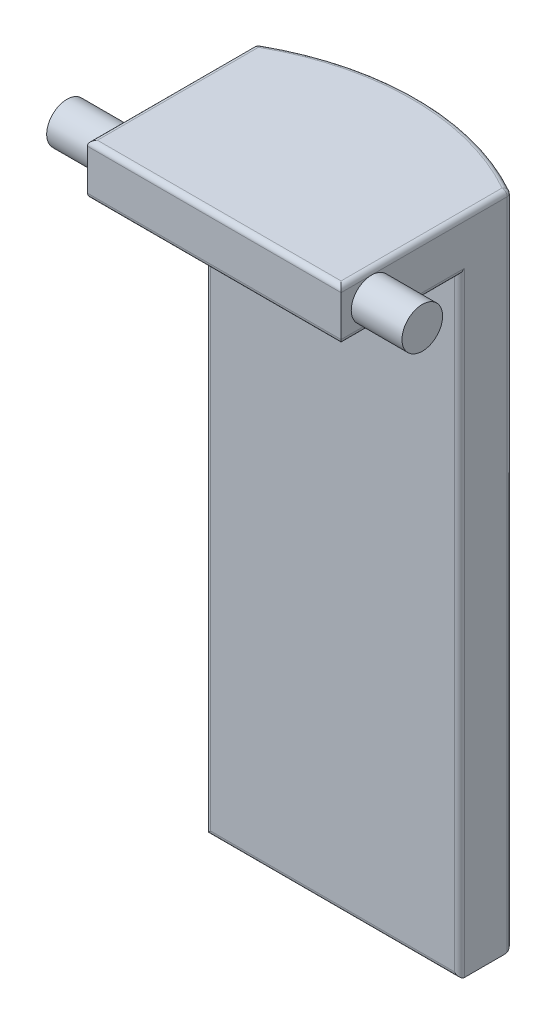
ISO-10303-21;
HEADER;
FILE_DESCRIPTION(('STEP AP214'),'2;1');
FILE_NAME('part.step','',(''),(''),'','','');
FILE_SCHEMA(('AUTOMOTIVE_DESIGN { 1 0 10303 214 1 1 1 1 }'));
ENDSEC;
DATA;
#1=APPLICATION_CONTEXT('core data for automotive mechanical design processes');
#2=APPLICATION_PROTOCOL_DEFINITION('international standard','automotive_design',2000,#1);
#3=PRODUCT_CONTEXT('',#1,'mechanical');
#4=PRODUCT('Part','Part','',(#3));
#5=PRODUCT_RELATED_PRODUCT_CATEGORY('part','',(#4));
#6=PRODUCT_DEFINITION_FORMATION('','',#4);
#7=PRODUCT_DEFINITION_CONTEXT('part definition',#1,'design');
#8=PRODUCT_DEFINITION('design','',#6,#7);
#9=PRODUCT_DEFINITION_SHAPE('','',#8);
#10=(LENGTH_UNIT() NAMED_UNIT(*) SI_UNIT(.MILLI.,.METRE.));
#11=(NAMED_UNIT(*) PLANE_ANGLE_UNIT() SI_UNIT($,.RADIAN.));
#12=(NAMED_UNIT(*) SI_UNIT($,.STERADIAN.) SOLID_ANGLE_UNIT());
#13=UNCERTAINTY_MEASURE_WITH_UNIT(LENGTH_MEASURE(1.E-05),#10,'distance_accuracy_value','');
#14=(GEOMETRIC_REPRESENTATION_CONTEXT(3) GLOBAL_UNCERTAINTY_ASSIGNED_CONTEXT((#13)) GLOBAL_UNIT_ASSIGNED_CONTEXT((#10,
#11,#12)) REPRESENTATION_CONTEXT('',''));
#15=CARTESIAN_POINT('',(0.,0.,0.));
#16=DIRECTION('',(0.,0.,1.));
#17=DIRECTION('',(1.,0.,0.));
#18=AXIS2_PLACEMENT_3D('',#15,#16,#17);
#19=CARTESIAN_POINT('',(12.5,-69.,0.));
#20=DIRECTION('',(-1.,0.,0.));
#21=DIRECTION('',(0.,0.,1.));
#22=AXIS2_PLACEMENT_3D('',#19,#20,#21);
#23=PLANE('',#22);
#24=DIRECTION('',(0.,1.,0.));
#25=VECTOR('',#24,1.);
#26=CARTESIAN_POINT('',(12.5,0.,-5.));
#27=LINE('',#26,#25);
#28=CARTESIAN_POINT('',(12.5,-4.5,-5.));
#29=VERTEX_POINT('',#28);
#30=CARTESIAN_POINT('',(12.5,-0.5,-5.));
#31=VERTEX_POINT('',#30);
#32=EDGE_CURVE('E304',#29,#31,#27,.T.);
#33=ORIENTED_EDGE('',*,*,#32,.F.);
#34=DIRECTION('',(0.,0.,1.));
#35=VECTOR('',#34,1.);
#36=CARTESIAN_POINT('',(12.5,-4.5,0.));
#37=LINE('',#36,#35);
#38=CARTESIAN_POINT('',(12.5,-4.5,-8.));
#39=VERTEX_POINT('',#38);
#40=EDGE_CURVE('E309',#29,#39,#37,.F.);
#41=ORIENTED_EDGE('',*,*,#40,.T.);
#42=CARTESIAN_POINT('',(12.5,-2.5,-8.));
#43=DIRECTION('',(-1.,0.,0.));
#44=DIRECTION('',(0.,0.,1.));
#45=AXIS2_PLACEMENT_3D('',#42,#43,#44);
#46=CIRCLE('',#45,2.);
#47=CARTESIAN_POINT('',(12.5,-0.5,-8.));
#48=VERTEX_POINT('',#47);
#49=EDGE_CURVE('E305',#39,#48,#46,.T.);
#50=ORIENTED_EDGE('',*,*,#49,.T.);
#51=DIRECTION('',(0.,0.,1.));
#52=VECTOR('',#51,1.);
#53=CARTESIAN_POINT('',(12.5,-0.5,-5.));
#54=LINE('',#53,#52);
#55=EDGE_CURVE('E320',#48,#31,#54,.T.);
#56=ORIENTED_EDGE('',*,*,#55,.T.);
#57=EDGE_LOOP('',(#33,#41,#50,#56));
#58=FACE_BOUND('',#57,.T.);
#59=ADVANCED_FACE('F38',(#58),#23,.F.);
#60=CARTESIAN_POINT('',(-12.5,-69.,0.));
#61=DIRECTION('',(-1.,0.,0.));
#62=DIRECTION('',(0.,0.,1.));
#63=AXIS2_PLACEMENT_3D('',#60,#61,#62);
#64=PLANE('',#63);
#65=CARTESIAN_POINT('',(-12.5,-2.5,-8.));
#66=DIRECTION('',(-1.,0.,0.));
#67=DIRECTION('',(0.,0.,1.));
#68=AXIS2_PLACEMENT_3D('',#65,#66,#67);
#69=CIRCLE('',#68,2.);
#70=CARTESIAN_POINT('',(-12.5,-4.5,-8.));
#71=VERTEX_POINT('',#70);
#72=CARTESIAN_POINT('',(-12.5,-0.5,-8.));
#73=VERTEX_POINT('',#72);
#74=EDGE_CURVE('E431',#71,#73,#69,.T.);
#75=ORIENTED_EDGE('',*,*,#74,.F.);
#76=DIRECTION('',(0.,0.,-1.));
#77=VECTOR('',#76,1.);
#78=CARTESIAN_POINT('',(-12.5,-4.5,-5.));
#79=LINE('',#78,#77);
#80=CARTESIAN_POINT('',(-12.5,-4.5,-5.));
#81=VERTEX_POINT('',#80);
#82=EDGE_CURVE('E391',#71,#81,#79,.F.);
#83=ORIENTED_EDGE('',*,*,#82,.T.);
#84=DIRECTION('',(0.,-1.,0.));
#85=VECTOR('',#84,1.);
#86=CARTESIAN_POINT('',(-12.5,-69.,-5.00000000000001));
#87=LINE('',#86,#85);
#88=CARTESIAN_POINT('',(-12.5,-0.5,-5.));
#89=VERTEX_POINT('',#88);
#90=EDGE_CURVE('E423',#89,#81,#87,.T.);
#91=ORIENTED_EDGE('',*,*,#90,.F.);
#92=DIRECTION('',(0.,0.,1.));
#93=VECTOR('',#92,1.);
#94=CARTESIAN_POINT('',(-12.5,-0.5,0.));
#95=LINE('',#94,#93);
#96=EDGE_CURVE('E158',#89,#73,#95,.F.);
#97=ORIENTED_EDGE('',*,*,#96,.T.);
#98=EDGE_LOOP('',(#75,#83,#91,#97));
#99=FACE_BOUND('',#98,.T.);
#100=ADVANCED_FACE('F271',(#99),#64,.T.);
#101=CARTESIAN_POINT('',(0.,-69.,0.));
#102=DIRECTION('',(0.,1.,0.));
#103=DIRECTION('',(0.,0.,1.));
#104=AXIS2_PLACEMENT_3D('',#101,#102,#103);
#105=CYLINDRICAL_SURFACE('',#104,25.);
#106=CARTESIAN_POINT('',(0.,-64.5,0.));
#107=DIRECTION('',(0.,1.,0.));
#108=DIRECTION('',(0.,0.,1.));
#109=AXIS2_PLACEMENT_3D('',#106,#107,#108);
#110=CIRCLE('',#109,25.);
#111=CARTESIAN_POINT('',(12.2448979591837,-64.5,-21.7959279217284));
#112=VERTEX_POINT('',#111);
#113=CARTESIAN_POINT('',(-12.2448979591837,-64.5,-21.7959279217284));
#114=VERTEX_POINT('',#113);
#115=EDGE_CURVE('E390',#112,#114,#110,.T.);
#116=ORIENTED_EDGE('',*,*,#115,.T.);
#117=DIRECTION('',(0.,1.,0.));
#118=VECTOR('',#117,1.);
#119=CARTESIAN_POINT('',(-12.2448979591837,-69.,-21.7959279217284));
#120=LINE('',#119,#118);
#121=CARTESIAN_POINT('',(-12.2448979591837,-0.5,-21.7959279217284));
#122=VERTEX_POINT('',#121);
#123=EDGE_CURVE('E394',#114,#122,#120,.T.);
#124=ORIENTED_EDGE('',*,*,#123,.T.);
#125=CARTESIAN_POINT('',(0.,-0.5,0.));
#126=DIRECTION('',(0.,1.,0.));
#127=DIRECTION('',(0.,0.,1.));
#128=AXIS2_PLACEMENT_3D('',#125,#126,#127);
#129=CIRCLE('',#128,25.);
#130=CARTESIAN_POINT('',(12.2448979591837,-0.5,-21.7959279217284));
#131=VERTEX_POINT('',#130);
#132=EDGE_CURVE('E393',#122,#131,#129,.F.);
#133=ORIENTED_EDGE('',*,*,#132,.T.);
#134=DIRECTION('',(0.,1.,0.));
#135=VECTOR('',#134,1.);
#136=CARTESIAN_POINT('',(12.2448979591837,-69.,-21.7959279217284));
#137=LINE('',#136,#135);
#138=EDGE_CURVE('E385',#131,#112,#137,.F.);
#139=ORIENTED_EDGE('',*,*,#138,.T.);
#140=EDGE_LOOP('',(#116,#124,#133,#139));
#141=FACE_BOUND('',#140,.T.);
#142=ADVANCED_FACE('F278',(#141),#105,.T.);
#143=CARTESIAN_POINT('',(0.,0.,0.));
#144=DIRECTION('',(0.,1.,0.));
#145=DIRECTION('',(0.,0.,1.));
#146=AXIS2_PLACEMENT_3D('',#143,#144,#145);
#147=PLANE('',#146);
#148=CARTESIAN_POINT('',(0.,0.,0.));
#149=DIRECTION('',(0.,1.,0.));
#150=DIRECTION('',(0.,0.,1.));
#151=AXIS2_PLACEMENT_3D('',#148,#149,#150);
#152=CIRCLE('',#151,24.5);
#153=CARTESIAN_POINT('',(12.,0.,-21.3600093632938));
#154=VERTEX_POINT('',#153);
#155=CARTESIAN_POINT('',(-12.,0.,-21.3600093632938));
#156=VERTEX_POINT('',#155);
#157=EDGE_CURVE('E177',#154,#156,#152,.T.);
#158=ORIENTED_EDGE('',*,*,#157,.T.);
#159=DIRECTION('',(0.,0.,1.));
#160=VECTOR('',#159,1.);
#161=CARTESIAN_POINT('',(-12.,0.,0.));
#162=LINE('',#161,#160);
#163=CARTESIAN_POINT('',(-12.,0.,-5.5));
#164=VERTEX_POINT('',#163);
#165=EDGE_CURVE('E156',#156,#164,#162,.T.);
#166=ORIENTED_EDGE('',*,*,#165,.T.);
#167=DIRECTION('',(1.,0.,0.));
#168=VECTOR('',#167,1.);
#169=CARTESIAN_POINT('',(12.5,0.,-5.5));
#170=LINE('',#169,#168);
#171=CARTESIAN_POINT('',(12.,0.,-5.5));
#172=VERTEX_POINT('',#171);
#173=EDGE_CURVE('E165',#164,#172,#170,.T.);
#174=ORIENTED_EDGE('',*,*,#173,.T.);
#175=DIRECTION('',(0.,0.,1.));
#176=VECTOR('',#175,1.);
#177=CARTESIAN_POINT('',(12.,0.,-21.650635094611));
#178=LINE('',#177,#176);
#179=EDGE_CURVE('E172',#172,#154,#178,.F.);
#180=ORIENTED_EDGE('',*,*,#179,.T.);
#181=EDGE_LOOP('',(#158,#166,#174,#180));
#182=FACE_BOUND('',#181,.T.);
#183=ADVANCED_FACE('F175',(#182),#147,.T.);
#184=EDGE_CURVE('E293',#48,#39,#46,.T.);
#185=ORIENTED_EDGE('',*,*,#184,.T.);
#186=DIRECTION('',(0.,0.,1.));
#187=VECTOR('',#186,1.);
#188=CARTESIAN_POINT('',(12.5,-4.5,0.));
#189=LINE('',#188,#187);
#190=CARTESIAN_POINT('',(12.5,-4.5,-17.150635094611));
#191=VERTEX_POINT('',#190);
#192=EDGE_CURVE('E295',#39,#191,#189,.F.);
#193=ORIENTED_EDGE('',*,*,#192,.T.);
#194=DIRECTION('',(0.,1.,0.));
#195=VECTOR('',#194,1.);
#196=CARTESIAN_POINT('',(12.5,-69.,-17.150635094611));
#197=LINE('',#196,#195);
#198=CARTESIAN_POINT('',(12.5,-65.,-17.150635094611));
#199=VERTEX_POINT('',#198);
#200=EDGE_CURVE('E314',#191,#199,#197,.F.);
#201=ORIENTED_EDGE('',*,*,#200,.T.);
#202=DIRECTION('',(0.,0.,1.));
#203=VECTOR('',#202,1.);
#204=CARTESIAN_POINT('',(12.5,-65.,-16.650635094611));
#205=LINE('',#204,#203);
#206=CARTESIAN_POINT('',(12.5,-65.,-21.0713075057055));
#207=VERTEX_POINT('',#206);
#208=EDGE_CURVE('E238',#207,#199,#205,.T.);
#209=ORIENTED_EDGE('',*,*,#208,.F.);
#210=CARTESIAN_POINT('',(12.5,-65.,-21.0713075057055));
#211=CARTESIAN_POINT('',(12.5,-65.0000306502536,-21.1144354710381));
#212=CARTESIAN_POINT('',(12.5,-64.995871424319,-21.1576928543187));
#213=CARTESIAN_POINT('',(12.5,-64.9794178640378,-21.2416037123669));
#214=CARTESIAN_POINT('',(12.5,-64.9673091091234,-21.2822939101771));
#215=CARTESIAN_POINT('',(12.5,-64.9458588525723,-21.3344084175351));
#216=CARTESIAN_POINT('',(12.5,-64.9400212094912,-21.3473202687149));
#217=CARTESIAN_POINT('',(12.5,-64.9337392476235,-21.3600093632938));
#218=B_SPLINE_CURVE_WITH_KNOTS('',3,(#210,#211,#212,#213,#214,#215,#216,#217),.UNSPECIFIED.,.F.,
.F.,(4,2,2,4),(0.,0.129419415813289,0.255920147616695,0.29839956822105),.UNSPECIFIED.);
#219=CARTESIAN_POINT('',(12.5,-64.9337392476235,-21.3600093632938));
#220=VERTEX_POINT('',#219);
#221=EDGE_CURVE('E405',#207,#220,#218,.T.);
#222=ORIENTED_EDGE('',*,*,#221,.T.);
#223=DIRECTION('',(0.,-1.,0.));
#224=VECTOR('',#223,1.);
#225=CARTESIAN_POINT('',(12.5,0.,-21.3600093632938));
#226=LINE('',#225,#224);
#227=CARTESIAN_POINT('',(12.5,-0.5,-21.3600093632938));
#228=VERTEX_POINT('',#227);
#229=EDGE_CURVE('E400',#220,#228,#226,.F.);
#230=ORIENTED_EDGE('',*,*,#229,.T.);
#231=DIRECTION('',(0.,0.,1.));
#232=VECTOR('',#231,1.);
#233=CARTESIAN_POINT('',(12.5,-0.5,-5.));
#234=LINE('',#233,#232);
#235=EDGE_CURVE('E298',#228,#48,#234,.T.);
#236=ORIENTED_EDGE('',*,*,#235,.T.);
#237=EDGE_LOOP('',(#185,#193,#201,#209,#222,#230,#236));
#238=FACE_BOUND('',#237,.T.);
#239=ADVANCED_FACE('F273',(#238),#23,.F.);
#240=DIRECTION('',(0.,-1.,0.));
#241=VECTOR('',#240,1.);
#242=CARTESIAN_POINT('',(-12.5,-5.,-17.150635094611));
#243=LINE('',#242,#241);
#244=CARTESIAN_POINT('',(-12.5,-65.,-17.150635094611));
#245=VERTEX_POINT('',#244);
#246=CARTESIAN_POINT('',(-12.5,-4.5,-17.150635094611));
#247=VERTEX_POINT('',#246);
#248=EDGE_CURVE('E482',#245,#247,#243,.F.);
#249=ORIENTED_EDGE('',*,*,#248,.T.);
#250=DIRECTION('',(0.,0.,-1.));
#251=VECTOR('',#250,1.);
#252=CARTESIAN_POINT('',(-12.5,-4.5,-5.));
#253=LINE('',#252,#251);
#254=EDGE_CURVE('E484',#247,#71,#253,.F.);
#255=ORIENTED_EDGE('',*,*,#254,.T.);
#256=EDGE_CURVE('E173',#73,#71,#69,.T.);
#257=ORIENTED_EDGE('',*,*,#256,.F.);
#258=DIRECTION('',(0.,0.,1.));
#259=VECTOR('',#258,1.);
#260=CARTESIAN_POINT('',(-12.5,-0.5,0.));
#261=LINE('',#260,#259);
#262=CARTESIAN_POINT('',(-12.5,-0.5,-21.3600093632938));
#263=VERTEX_POINT('',#262);
#264=EDGE_CURVE('E197',#73,#263,#261,.F.);
#265=ORIENTED_EDGE('',*,*,#264,.T.);
#266=DIRECTION('',(0.,1.,0.));
#267=VECTOR('',#266,1.);
#268=CARTESIAN_POINT('',(-12.5,-69.,-21.3600093632938));
#269=LINE('',#268,#267);
#270=CARTESIAN_POINT('',(-12.5,-64.9337392476235,-21.3600093632938));
#271=VERTEX_POINT('',#270);
#272=EDGE_CURVE('E180',#263,#271,#269,.F.);
#273=ORIENTED_EDGE('',*,*,#272,.T.);
#274=CARTESIAN_POINT('',(-12.5,-64.9337392476235,-21.3600093632938));
#275=CARTESIAN_POINT('',(-12.5,-64.9529591126697,-21.3211994609414));
#276=CARTESIAN_POINT('',(-12.5,-64.9679865338698,-21.2803871246245));
#277=CARTESIAN_POINT('',(-12.5,-64.9894526563694,-21.1974858388549));
#278=CARTESIAN_POINT('',(-12.5,-64.9960689104194,-21.1554431416842));
#279=CARTESIAN_POINT('',(-12.5,-64.9995678394943,-21.0992556973158));
#280=CARTESIAN_POINT('',(-12.5,-65.000001484785,-21.085276273918));
#281=CARTESIAN_POINT('',(-12.5,-65.,-21.0713075057055));
#282=B_SPLINE_CURVE_WITH_KNOTS('',3,(#274,#275,#276,#277,#278,#279,#280,#281),.UNSPECIFIED.,.F.,
.F.,(4,2,2,4),(0.,0.129620762898399,0.256457262752572,0.298384799293105),.UNSPECIFIED.);
#283=CARTESIAN_POINT('',(-12.5,-65.,-21.0713075057055));
#284=VERTEX_POINT('',#283);
#285=EDGE_CURVE('E184',#271,#284,#282,.T.);
#286=ORIENTED_EDGE('',*,*,#285,.T.);
#287=DIRECTION('',(0.,0.,-1.));
#288=VECTOR('',#287,1.);
#289=CARTESIAN_POINT('',(-12.5,-65.,0.));
#290=LINE('',#289,#288);
#291=EDGE_CURVE('E445',#245,#284,#290,.T.);
#292=ORIENTED_EDGE('',*,*,#291,.F.);
#293=EDGE_LOOP('',(#249,#255,#257,#265,#273,#286,#292));
#294=FACE_BOUND('',#293,.T.);
#295=ADVANCED_FACE('F199',(#294),#64,.T.);
#296=CARTESIAN_POINT('',(-56.5,-5.,0.));
#297=DIRECTION('',(0.,1.,0.));
#298=DIRECTION('',(0.,0.,1.));
#299=AXIS2_PLACEMENT_3D('',#296,#297,#298);
#300=PLANE('',#299);
#301=DIRECTION('',(1.,0.,0.));
#302=VECTOR('',#301,1.);
#303=CARTESIAN_POINT('',(-56.5,-5.,-16.650635094611));
#304=LINE('',#303,#302);
#305=CARTESIAN_POINT('',(-12.,-5.,-16.650635094611));
#306=VERTEX_POINT('',#305);
#307=CARTESIAN_POINT('',(12.,-5.,-16.650635094611));
#308=VERTEX_POINT('',#307);
#309=EDGE_CURVE('E432',#306,#308,#304,.T.);
#310=ORIENTED_EDGE('',*,*,#309,.T.);
#311=DIRECTION('',(0.,0.,1.));
#312=VECTOR('',#311,1.);
#313=CARTESIAN_POINT('',(12.,-5.,0.));
#314=LINE('',#313,#312);
#315=CARTESIAN_POINT('',(12.,-5.,-5.5));
#316=VERTEX_POINT('',#315);
#317=EDGE_CURVE('E11',#308,#316,#314,.T.);
#318=ORIENTED_EDGE('',*,*,#317,.T.);
#319=DIRECTION('',(-1.,0.,0.));
#320=VECTOR('',#319,1.);
#321=CARTESIAN_POINT('',(-56.5,-5.,-5.50000000000001));
#322=LINE('',#321,#320);
#323=CARTESIAN_POINT('',(-12.,-5.,-5.5));
#324=VERTEX_POINT('',#323);
#325=EDGE_CURVE('E48',#316,#324,#322,.T.);
#326=ORIENTED_EDGE('',*,*,#325,.T.);
#327=DIRECTION('',(0.,0.,-1.));
#328=VECTOR('',#327,1.);
#329=CARTESIAN_POINT('',(-12.,-5.,-16.650635094611));
#330=LINE('',#329,#328);
#331=EDGE_CURVE('E346',#324,#306,#330,.T.);
#332=ORIENTED_EDGE('',*,*,#331,.T.);
#333=EDGE_LOOP('',(#310,#318,#326,#332));
#334=FACE_BOUND('',#333,.T.);
#335=ADVANCED_FACE('F289',(#334),#300,.F.);
#336=CARTESIAN_POINT('',(-56.5,-5.,-16.650635094611));
#337=DIRECTION('',(0.,0.,-1.));
#338=DIRECTION('',(-1.,0.,0.));
#339=AXIS2_PLACEMENT_3D('',#336,#337,#338);
#340=PLANE('',#339);
#341=ORIENTED_EDGE('',*,*,#309,.F.);
#342=DIRECTION('',(0.,-1.,0.));
#343=VECTOR('',#342,1.);
#344=CARTESIAN_POINT('',(-12.,-65.,-16.650635094611));
#345=LINE('',#344,#343);
#346=CARTESIAN_POINT('',(-12.,-64.5,-16.650635094611));
#347=VERTEX_POINT('',#346);
#348=EDGE_CURVE('E336',#306,#347,#345,.T.);
#349=ORIENTED_EDGE('',*,*,#348,.T.);
#350=DIRECTION('',(1.,0.,0.));
#351=VECTOR('',#350,1.);
#352=CARTESIAN_POINT('',(-56.5,-64.5,-16.650635094611));
#353=LINE('',#352,#351);
#354=CARTESIAN_POINT('',(12.,-64.5,-16.650635094611));
#355=VERTEX_POINT('',#354);
#356=EDGE_CURVE('E332',#347,#355,#353,.T.);
#357=ORIENTED_EDGE('',*,*,#356,.T.);
#358=DIRECTION('',(0.,1.,0.));
#359=VECTOR('',#358,1.);
#360=CARTESIAN_POINT('',(12.,-5.,-16.650635094611));
#361=LINE('',#360,#359);
#362=EDGE_CURVE('E329',#355,#308,#361,.T.);
#363=ORIENTED_EDGE('',*,*,#362,.T.);
#364=EDGE_LOOP('',(#341,#349,#357,#363));
#365=FACE_BOUND('',#364,.T.);
#366=ADVANCED_FACE('F481',(#365),#340,.F.);
#367=CARTESIAN_POINT('',(-56.5,0.,-5.00000000000001));
#368=DIRECTION('',(0.,0.,-1.));
#369=DIRECTION('',(-1.,0.,0.));
#370=AXIS2_PLACEMENT_3D('',#367,#368,#369);
#371=PLANE('',#370);
#372=ORIENTED_EDGE('',*,*,#32,.T.);
#373=DIRECTION('',(1.,0.,0.));
#374=VECTOR('',#373,1.);
#375=CARTESIAN_POINT('',(-12.5,-0.5,-5.));
#376=LINE('',#375,#374);
#377=EDGE_CURVE('E326',#31,#89,#376,.F.);
#378=ORIENTED_EDGE('',*,*,#377,.T.);
#379=ORIENTED_EDGE('',*,*,#90,.T.);
#380=DIRECTION('',(-1.,0.,0.));
#381=VECTOR('',#380,1.);
#382=CARTESIAN_POINT('',(-56.5,-4.5,-5.00000000000001));
#383=LINE('',#382,#381);
#384=EDGE_CURVE('E318',#81,#29,#383,.F.);
#385=ORIENTED_EDGE('',*,*,#384,.T.);
#386=EDGE_LOOP('',(#372,#378,#379,#385));
#387=FACE_BOUND('',#386,.T.);
#388=ADVANCED_FACE('F418',(#387),#371,.F.);
#389=CARTESIAN_POINT('',(-17.5,-2.5,-8.));
#390=DIRECTION('',(1.,0.,0.));
#391=DIRECTION('',(0.,0.,-1.));
#392=AXIS2_PLACEMENT_3D('',#389,#390,#391);
#393=PLANE('',#392);
#394=CARTESIAN_POINT('',(-17.5,-2.5,-8.));
#395=DIRECTION('',(1.,0.,0.));
#396=DIRECTION('',(0.,0.,-1.));
#397=AXIS2_PLACEMENT_3D('',#394,#395,#396);
#398=CIRCLE('',#397,2.);
#399=CARTESIAN_POINT('',(-17.5,-2.5,-10.));
#400=VERTEX_POINT('',#399);
#401=EDGE_CURVE('E437',#400,#400,#398,.T.);
#402=ORIENTED_EDGE('',*,*,#401,.F.);
#403=EDGE_LOOP('',(#402));
#404=FACE_BOUND('',#403,.T.);
#405=ADVANCED_FACE('F563',(#404),#393,.F.);
#406=CARTESIAN_POINT('',(-17.5,-2.5,-8.));
#407=DIRECTION('',(1.,0.,0.));
#408=DIRECTION('',(0.,0.,-1.));
#409=AXIS2_PLACEMENT_3D('',#406,#407,#408);
#410=CYLINDRICAL_SURFACE('',#409,2.);
#411=ORIENTED_EDGE('',*,*,#256,.T.);
#412=ORIENTED_EDGE('',*,*,#74,.T.);
#413=EDGE_LOOP('',(#411,#412));
#414=FACE_BOUND('',#413,.T.);
#415=ORIENTED_EDGE('',*,*,#401,.T.);
#416=EDGE_LOOP('',(#415));
#417=FACE_BOUND('',#416,.T.);
#418=ADVANCED_FACE('F496',(#414,#417),#410,.T.);
#419=CARTESIAN_POINT('',(17.5,-2.5,-8.));
#420=DIRECTION('',(1.,0.,0.));
#421=DIRECTION('',(0.,0.,-1.));
#422=AXIS2_PLACEMENT_3D('',#419,#420,#421);
#423=CIRCLE('',#422,2.);
#424=CARTESIAN_POINT('',(17.5,-2.5,-10.));
#425=VERTEX_POINT('',#424);
#426=EDGE_CURVE('E441',#425,#425,#423,.T.);
#427=ORIENTED_EDGE('',*,*,#426,.F.);
#428=EDGE_LOOP('',(#427));
#429=FACE_BOUND('',#428,.T.);
#430=ORIENTED_EDGE('',*,*,#184,.F.);
#431=ORIENTED_EDGE('',*,*,#49,.F.);
#432=EDGE_LOOP('',(#430,#431));
#433=FACE_BOUND('',#432,.T.);
#434=ADVANCED_FACE('F546',(#429,#433),#410,.T.);
#435=CARTESIAN_POINT('',(17.5,-2.5,-8.));
#436=DIRECTION('',(1.,0.,0.));
#437=DIRECTION('',(0.,0.,-1.));
#438=AXIS2_PLACEMENT_3D('',#435,#436,#437);
#439=PLANE('',#438);
#440=ORIENTED_EDGE('',*,*,#426,.T.);
#441=EDGE_LOOP('',(#440));
#442=FACE_BOUND('',#441,.T.);
#443=ADVANCED_FACE('F537',(#442),#439,.T.);
#444=CARTESIAN_POINT('',(-17.5,-65.,-16.650635094611));
#445=DIRECTION('',(0.,1.,0.));
#446=DIRECTION('',(0.,0.,1.));
#447=AXIS2_PLACEMENT_3D('',#444,#445,#446);
#448=PLANE('',#447);
#449=ORIENTED_EDGE('',*,*,#208,.T.);
#450=DIRECTION('',(1.,0.,0.));
#451=VECTOR('',#450,1.);
#452=CARTESIAN_POINT('',(-17.5,-65.,-17.150635094611));
#453=LINE('',#452,#451);
#454=EDGE_CURVE('E342',#199,#245,#453,.F.);
#455=ORIENTED_EDGE('',*,*,#454,.T.);
#456=ORIENTED_EDGE('',*,*,#291,.T.);
#457=CARTESIAN_POINT('',(0.,-65.,0.));
#458=DIRECTION('',(0.,1.,0.));
#459=DIRECTION('',(0.,0.,1.));
#460=AXIS2_PLACEMENT_3D('',#457,#458,#459);
#461=CIRCLE('',#460,24.5);
#462=EDGE_CURVE('E339',#284,#207,#461,.F.);
#463=ORIENTED_EDGE('',*,*,#462,.T.);
#464=EDGE_LOOP('',(#449,#455,#456,#463));
#465=FACE_BOUND('',#464,.T.);
#466=ADVANCED_FACE('F245',(#465),#448,.F.);
#467=CARTESIAN_POINT('',(12.,-69.,-21.3600093632938));
#468=DIRECTION('',(0.,1.,0.));
#469=DIRECTION('',(0.,0.,1.));
#470=AXIS2_PLACEMENT_3D('',#467,#468,#469);
#471=CYLINDRICAL_SURFACE('',#470,0.5);
#472=CARTESIAN_POINT('',(12.,-0.5,-21.3600093632938));
#473=DIRECTION('',(0.,1.,0.));
#474=DIRECTION('',(0.,0.,1.));
#475=AXIS2_PLACEMENT_3D('',#472,#473,#474);
#476=CIRCLE('',#475,0.5);
#477=EDGE_CURVE('E239',#228,#131,#476,.T.);
#478=ORIENTED_EDGE('',*,*,#477,.F.);
#479=ORIENTED_EDGE('',*,*,#229,.F.);
#480=CARTESIAN_POINT('',(12.5,-64.9337392476235,-21.3600093632938));
#481=CARTESIAN_POINT('',(12.4999647044968,-64.9182954563024,-21.3911474722137));
#482=CARTESIAN_POINT('',(12.4970990540357,-64.9010114724677,-21.4211254287435));
#483=CARTESIAN_POINT('',(12.48668694637,-64.8638584835312,-21.4782394687068));
#484=CARTESIAN_POINT('',(12.4791791029237,-64.8440118611124,-21.5053968588971));
#485=CARTESIAN_POINT('',(12.4576222269717,-64.7963319066022,-21.5645799584676));
#486=CARTESIAN_POINT('',(12.442287282573,-64.7678873393451,-21.5956261352261));
#487=CARTESIAN_POINT('',(12.4066445004382,-64.7091311241989,-21.6528950450283));
#488=CARTESIAN_POINT('',(12.3863176264116,-64.6788126696414,-21.6790986246048));
#489=CARTESIAN_POINT('',(12.3467620997228,-64.624231141872,-21.7211030207324));
#490=CARTESIAN_POINT('',(12.3283291768073,-64.6001535043489,-21.7379154587451));
#491=CARTESIAN_POINT('',(12.289448916797,-64.551771698249,-21.7684557543794));
#492=CARTESIAN_POINT('',(12.2690067258346,-64.5274682456439,-21.7821912110974));
#493=CARTESIAN_POINT('',(12.2467622569459,-64.5021187761299,-21.7948766203591));
#494=CARTESIAN_POINT('',(12.2458309316936,-64.5010593688234,-21.7954037767808));
#495=CARTESIAN_POINT('',(12.2448979591837,-64.5,-21.7959279217284));
#496=B_SPLINE_CURVE_WITH_KNOTS('',3,(#480,#481,#482,#483,#484,#485,#486,#487,#488,#489,#490,
#491,#492,#493,#494,#495),.UNSPECIFIED.,.F.,.F.,(4,2,2,2,2,2,2,4),(0.,0.10377110778221,
0.206690448396533,0.340448297909584,0.474724365192657,0.57855939088652,0.682135080837569,
0.686652632110638),.UNSPECIFIED.);
#497=EDGE_CURVE('E229',#112,#220,#496,.F.);
#498=ORIENTED_EDGE('',*,*,#497,.F.);
#499=ORIENTED_EDGE('',*,*,#138,.F.);
#500=EDGE_LOOP('',(#478,#479,#498,#499));
#501=FACE_BOUND('',#500,.T.);
#502=ADVANCED_FACE('F209',(#501),#471,.T.);
#503=CARTESIAN_POINT('',(0.,-64.5,0.));
#504=DIRECTION('',(0.,1.,0.));
#505=DIRECTION('',(0.,0.,1.));
#506=AXIS2_PLACEMENT_3D('',#503,#504,#505);
#507=TOROIDAL_SURFACE('',#506,24.5,0.5);
#508=ORIENTED_EDGE('',*,*,#462,.F.);
#509=ORIENTED_EDGE('',*,*,#285,.F.);
#510=CARTESIAN_POINT('',(-12.5,-64.9337392476235,-21.3600093632938));
#511=CARTESIAN_POINT('',(-12.4999647044968,-64.9182954563024,-21.3911474722137));
#512=CARTESIAN_POINT('',(-12.4970990540357,-64.9010114724677,-21.4211254287435));
#513=CARTESIAN_POINT('',(-12.48668694637,-64.8638584835312,-21.4782394687068));
#514=CARTESIAN_POINT('',(-12.4791791029237,-64.8440118611124,-21.5053968588971));
#515=CARTESIAN_POINT('',(-12.4576222269717,-64.7963319066022,-21.5645799584676));
#516=CARTESIAN_POINT('',(-12.442287282573,-64.7678873393451,-21.5956261352261));
#517=CARTESIAN_POINT('',(-12.4066445004382,-64.7091311241989,-21.6528950450283));
#518=CARTESIAN_POINT('',(-12.3863176264116,-64.6788126696414,-21.6790986246048));
#519=CARTESIAN_POINT('',(-12.3467620997228,-64.624231141872,-21.7211030207324));
#520=CARTESIAN_POINT('',(-12.3283291768073,-64.6001535043489,-21.7379154587451));
#521=CARTESIAN_POINT('',(-12.289448916797,-64.551771698249,-21.7684557543794));
#522=CARTESIAN_POINT('',(-12.2690067258346,-64.5274682456439,-21.7821912110974));
#523=CARTESIAN_POINT('',(-12.2467622569459,-64.5021187761299,-21.7948766203591));
#524=CARTESIAN_POINT('',(-12.2458309316936,-64.5010593688234,-21.7954037767808));
#525=CARTESIAN_POINT('',(-12.2448979591837,-64.5,-21.7959279217284));
#526=B_SPLINE_CURVE_WITH_KNOTS('',3,(#510,#511,#512,#513,#514,#515,#516,#517,#518,#519,#520,
#521,#522,#523,#524,#525),.UNSPECIFIED.,.F.,.F.,(4,2,2,2,2,2,2,4),(0.,0.10377110778221,
0.206690448396533,0.340448297909584,0.474724365192657,0.57855939088652,0.682135080837569,
0.686652632110638),.UNSPECIFIED.);
#527=EDGE_CURVE('E219',#114,#271,#526,.F.);
#528=ORIENTED_EDGE('',*,*,#527,.F.);
#529=ORIENTED_EDGE('',*,*,#115,.F.);
#530=ORIENTED_EDGE('',*,*,#497,.T.);
#531=ORIENTED_EDGE('',*,*,#221,.F.);
#532=EDGE_LOOP('',(#508,#509,#528,#529,#530,#531));
#533=FACE_BOUND('',#532,.T.);
#534=ADVANCED_FACE('F203',(#533),#507,.T.);
#535=CARTESIAN_POINT('',(12.,-0.5,-21.3600093632938));
#536=DIRECTION('',(0.,1.,0.));
#537=DIRECTION('',(0.,0.,1.));
#538=AXIS2_PLACEMENT_3D('',#535,#536,#537);
#539=SPHERICAL_SURFACE('',#538,0.5);
#540=CARTESIAN_POINT('',(12.,-0.5,-21.3600093632938));
#541=DIRECTION('',(0.,0.,-1.));
#542=DIRECTION('',(-1.,0.,0.));
#543=AXIS2_PLACEMENT_3D('',#540,#541,#542);
#544=CIRCLE('',#543,0.5);
#545=EDGE_CURVE('E363',#228,#154,#544,.F.);
#546=ORIENTED_EDGE('',*,*,#545,.F.);
#547=ORIENTED_EDGE('',*,*,#477,.T.);
#548=CARTESIAN_POINT('',(12.,-0.5,-21.3600093632938));
#549=DIRECTION('',(0.871837116869134,0.,0.489795918367349));
#550=DIRECTION('',(0.489795918367349,0.,-0.871837116869134));
#551=AXIS2_PLACEMENT_3D('',#548,#549,#550);
#552=CIRCLE('',#551,0.5);
#553=EDGE_CURVE('E366',#154,#131,#552,.F.);
#554=ORIENTED_EDGE('',*,*,#553,.F.);
#555=EDGE_LOOP('',(#546,#547,#554));
#556=FACE_BOUND('',#555,.T.);
#557=ADVANCED_FACE('F208',(#556),#539,.T.);
#558=CARTESIAN_POINT('',(-12.,-69.,-21.3600093632938));
#559=DIRECTION('',(0.,1.,0.));
#560=DIRECTION('',(0.,0.,1.));
#561=AXIS2_PLACEMENT_3D('',#558,#559,#560);
#562=CYLINDRICAL_SURFACE('',#561,0.5);
#563=ORIENTED_EDGE('',*,*,#527,.T.);
#564=ORIENTED_EDGE('',*,*,#272,.F.);
#565=CARTESIAN_POINT('',(-12.,-0.5,-21.3600093632938));
#566=DIRECTION('',(0.,1.,0.));
#567=DIRECTION('',(-1.,0.,0.));
#568=AXIS2_PLACEMENT_3D('',#565,#566,#567);
#569=CIRCLE('',#568,0.5);
#570=EDGE_CURVE('E359',#122,#263,#569,.T.);
#571=ORIENTED_EDGE('',*,*,#570,.F.);
#572=ORIENTED_EDGE('',*,*,#123,.F.);
#573=EDGE_LOOP('',(#563,#564,#571,#572));
#574=FACE_BOUND('',#573,.T.);
#575=ADVANCED_FACE('F213',(#574),#562,.T.);
#576=CARTESIAN_POINT('',(0.,-0.5,0.));
#577=DIRECTION('',(0.,1.,0.));
#578=DIRECTION('',(0.,0.,1.));
#579=AXIS2_PLACEMENT_3D('',#576,#577,#578);
#580=TOROIDAL_SURFACE('',#579,24.5,0.5);
#581=ORIENTED_EDGE('',*,*,#553,.T.);
#582=ORIENTED_EDGE('',*,*,#132,.F.);
#583=CARTESIAN_POINT('',(-12.,-0.5,-21.3600093632938));
#584=DIRECTION('',(-0.871837116869136,0.,0.489795918367347));
#585=DIRECTION('',(0.489795918367347,0.,0.871837116869136));
#586=AXIS2_PLACEMENT_3D('',#583,#584,#585);
#587=CIRCLE('',#586,0.5);
#588=EDGE_CURVE('E355',#156,#122,#587,.T.);
#589=ORIENTED_EDGE('',*,*,#588,.F.);
#590=ORIENTED_EDGE('',*,*,#157,.F.);
#591=EDGE_LOOP('',(#581,#582,#589,#590));
#592=FACE_BOUND('',#591,.T.);
#593=ADVANCED_FACE('F211',(#592),#580,.T.);
#594=CARTESIAN_POINT('',(12.,-0.5,0.));
#595=DIRECTION('',(0.,0.,-1.));
#596=DIRECTION('',(-1.,0.,0.));
#597=AXIS2_PLACEMENT_3D('',#594,#595,#596);
#598=CYLINDRICAL_SURFACE('',#597,0.5);
#599=ORIENTED_EDGE('',*,*,#545,.T.);
#600=ORIENTED_EDGE('',*,*,#179,.F.);
#601=CARTESIAN_POINT('',(12.,-0.5,-5.5));
#602=DIRECTION('',(-0.707106781186548,0.,0.707106781186547));
#603=DIRECTION('',(-0.707106781186547,0.,-0.707106781186548));
#604=AXIS2_PLACEMENT_3D('',#601,#602,#603);
#605=ELLIPSE('',#604,0.707106781186547,0.5);
#606=EDGE_CURVE('E168',#31,#172,#605,.T.);
#607=ORIENTED_EDGE('',*,*,#606,.F.);
#608=ORIENTED_EDGE('',*,*,#55,.F.);
#609=ORIENTED_EDGE('',*,*,#235,.F.);
#610=EDGE_LOOP('',(#599,#600,#607,#608,#609));
#611=FACE_BOUND('',#610,.T.);
#612=ADVANCED_FACE('F425',(#611),#598,.T.);
#613=CARTESIAN_POINT('',(-12.,-0.5,-21.3600093632938));
#614=DIRECTION('',(0.,1.,0.));
#615=DIRECTION('',(0.,0.,1.));
#616=AXIS2_PLACEMENT_3D('',#613,#614,#615);
#617=SPHERICAL_SURFACE('',#616,0.5);
#618=ORIENTED_EDGE('',*,*,#588,.T.);
#619=ORIENTED_EDGE('',*,*,#570,.T.);
#620=CARTESIAN_POINT('',(-12.,-0.5,-21.3600093632938));
#621=DIRECTION('',(0.,0.,-1.));
#622=DIRECTION('',(-1.,0.,0.));
#623=AXIS2_PLACEMENT_3D('',#620,#621,#622);
#624=CIRCLE('',#623,0.5);
#625=EDGE_CURVE('E162',#156,#263,#624,.F.);
#626=ORIENTED_EDGE('',*,*,#625,.F.);
#627=EDGE_LOOP('',(#618,#619,#626));
#628=FACE_BOUND('',#627,.T.);
#629=ADVANCED_FACE('F502',(#628),#617,.T.);
#630=CARTESIAN_POINT('',(0.,-0.5,-5.5));
#631=DIRECTION('',(-1.,0.,0.));
#632=DIRECTION('',(0.,0.,1.));
#633=AXIS2_PLACEMENT_3D('',#630,#631,#632);
#634=CYLINDRICAL_SURFACE('',#633,0.5);
#635=ORIENTED_EDGE('',*,*,#606,.T.);
#636=ORIENTED_EDGE('',*,*,#173,.F.);
#637=CARTESIAN_POINT('',(-12.,-0.5,-5.5));
#638=DIRECTION('',(-0.707106781186547,0.,-0.707106781186547));
#639=DIRECTION('',(-0.707106781186547,0.,0.707106781186547));
#640=AXIS2_PLACEMENT_3D('',#637,#638,#639);
#641=ELLIPSE('',#640,0.707106781186547,0.5);
#642=EDGE_CURVE('E151',#89,#164,#641,.T.);
#643=ORIENTED_EDGE('',*,*,#642,.F.);
#644=ORIENTED_EDGE('',*,*,#377,.F.);
#645=EDGE_LOOP('',(#635,#636,#643,#644));
#646=FACE_BOUND('',#645,.T.);
#647=ADVANCED_FACE('F166',(#646),#634,.T.);
#648=CARTESIAN_POINT('',(-12.,-0.5,0.));
#649=DIRECTION('',(0.,0.,1.));
#650=DIRECTION('',(1.,0.,0.));
#651=AXIS2_PLACEMENT_3D('',#648,#649,#650);
#652=CYLINDRICAL_SURFACE('',#651,0.5);
#653=ORIENTED_EDGE('',*,*,#264,.F.);
#654=ORIENTED_EDGE('',*,*,#96,.F.);
#655=ORIENTED_EDGE('',*,*,#642,.T.);
#656=ORIENTED_EDGE('',*,*,#165,.F.);
#657=ORIENTED_EDGE('',*,*,#625,.T.);
#658=EDGE_LOOP('',(#653,#654,#655,#656,#657));
#659=FACE_BOUND('',#658,.T.);
#660=ADVANCED_FACE('F153',(#659),#652,.T.);
#661=CARTESIAN_POINT('',(-56.5,-4.5,-5.50000000000001));
#662=DIRECTION('',(-1.,0.,0.));
#663=DIRECTION('',(0.,0.,1.));
#664=AXIS2_PLACEMENT_3D('',#661,#662,#663);
#665=CYLINDRICAL_SURFACE('',#664,0.5);
#666=CARTESIAN_POINT('',(12.,-4.5,-5.5));
#667=DIRECTION('',(-0.707106781186548,0.,0.707106781186547));
#668=DIRECTION('',(0.707106781186547,0.,0.707106781186548));
#669=AXIS2_PLACEMENT_3D('',#666,#667,#668);
#670=ELLIPSE('',#669,0.707106781186547,0.5);
#671=EDGE_CURVE('E471',#29,#316,#670,.F.);
#672=ORIENTED_EDGE('',*,*,#671,.F.);
#673=ORIENTED_EDGE('',*,*,#384,.F.);
#674=CARTESIAN_POINT('',(-12.,-4.5,-5.5));
#675=DIRECTION('',(0.707106781186547,0.,0.707106781186547));
#676=DIRECTION('',(-0.707106781186547,0.,0.707106781186547));
#677=AXIS2_PLACEMENT_3D('',#674,#675,#676);
#678=ELLIPSE('',#677,0.707106781186547,0.5);
#679=EDGE_CURVE('E42',#324,#81,#678,.F.);
#680=ORIENTED_EDGE('',*,*,#679,.F.);
#681=ORIENTED_EDGE('',*,*,#325,.F.);
#682=EDGE_LOOP('',(#672,#673,#680,#681));
#683=FACE_BOUND('',#682,.T.);
#684=ADVANCED_FACE('F40',(#683),#665,.T.);
#685=CARTESIAN_POINT('',(-12.,-4.5,0.));
#686=DIRECTION('',(0.,0.,1.));
#687=DIRECTION('',(0.,-1.,0.));
#688=AXIS2_PLACEMENT_3D('',#685,#686,#687);
#689=CYLINDRICAL_SURFACE('',#688,0.5);
#690=ORIENTED_EDGE('',*,*,#82,.F.);
#691=ORIENTED_EDGE('',*,*,#254,.F.);
#692=CARTESIAN_POINT('',(-12.,-4.5,-17.150635094611));
#693=DIRECTION('',(0.,0.707106781186547,0.707106781186548));
#694=DIRECTION('',(0.,-0.707106781186548,0.707106781186547));
#695=AXIS2_PLACEMENT_3D('',#692,#693,#694);
#696=ELLIPSE('',#695,0.707106781186548,0.5);
#697=EDGE_CURVE('E466',#306,#247,#696,.F.);
#698=ORIENTED_EDGE('',*,*,#697,.F.);
#699=ORIENTED_EDGE('',*,*,#331,.F.);
#700=ORIENTED_EDGE('',*,*,#679,.T.);
#701=EDGE_LOOP('',(#690,#691,#698,#699,#700));
#702=FACE_BOUND('',#701,.T.);
#703=ADVANCED_FACE('F261',(#702),#689,.T.);
#704=CARTESIAN_POINT('',(12.,-4.5,0.));
#705=DIRECTION('',(0.,0.,1.));
#706=DIRECTION('',(0.,-1.,0.));
#707=AXIS2_PLACEMENT_3D('',#704,#705,#706);
#708=CYLINDRICAL_SURFACE('',#707,0.5);
#709=ORIENTED_EDGE('',*,*,#671,.T.);
#710=ORIENTED_EDGE('',*,*,#317,.F.);
#711=CARTESIAN_POINT('',(12.,-4.5,-17.150635094611));
#712=DIRECTION('',(0.,0.707106781186547,0.707106781186548));
#713=DIRECTION('',(0.,-0.707106781186548,0.707106781186547));
#714=AXIS2_PLACEMENT_3D('',#711,#712,#713);
#715=ELLIPSE('',#714,0.707106781186548,0.5);
#716=EDGE_CURVE('E311',#191,#308,#715,.F.);
#717=ORIENTED_EDGE('',*,*,#716,.F.);
#718=ORIENTED_EDGE('',*,*,#192,.F.);
#719=ORIENTED_EDGE('',*,*,#40,.F.);
#720=EDGE_LOOP('',(#709,#710,#717,#718,#719));
#721=FACE_BOUND('',#720,.T.);
#722=ADVANCED_FACE('F258',(#721),#708,.T.);
#723=CARTESIAN_POINT('',(-12.,-5.,-17.150635094611));
#724=DIRECTION('',(0.,1.,0.));
#725=DIRECTION('',(0.,0.,1.));
#726=AXIS2_PLACEMENT_3D('',#723,#724,#725);
#727=CYLINDRICAL_SURFACE('',#726,0.5);
#728=ORIENTED_EDGE('',*,*,#697,.T.);
#729=ORIENTED_EDGE('',*,*,#248,.F.);
#730=CARTESIAN_POINT('',(-12.,-64.5,-17.150635094611));
#731=DIRECTION('',(-0.707106781186547,0.707106781186547,0.));
#732=DIRECTION('',(0.707106781186547,0.707106781186547,0.));
#733=AXIS2_PLACEMENT_3D('',#730,#731,#732);
#734=ELLIPSE('',#733,0.707106781186547,0.5);
#735=EDGE_CURVE('E461',#347,#245,#734,.F.);
#736=ORIENTED_EDGE('',*,*,#735,.F.);
#737=ORIENTED_EDGE('',*,*,#348,.F.);
#738=EDGE_LOOP('',(#728,#729,#736,#737));
#739=FACE_BOUND('',#738,.T.);
#740=ADVANCED_FACE('F254',(#739),#727,.T.);
#741=CARTESIAN_POINT('',(12.,-5.,-17.150635094611));
#742=DIRECTION('',(0.,1.,0.));
#743=DIRECTION('',(0.,0.,1.));
#744=AXIS2_PLACEMENT_3D('',#741,#742,#743);
#745=CYLINDRICAL_SURFACE('',#744,0.5);
#746=ORIENTED_EDGE('',*,*,#716,.T.);
#747=ORIENTED_EDGE('',*,*,#362,.F.);
#748=CARTESIAN_POINT('',(12.,-64.5,-17.150635094611));
#749=DIRECTION('',(0.707106781186547,0.707106781186547,0.));
#750=DIRECTION('',(-0.707106781186547,0.707106781186547,0.));
#751=AXIS2_PLACEMENT_3D('',#748,#749,#750);
#752=ELLIPSE('',#751,0.707106781186547,0.5);
#753=EDGE_CURVE('E240',#199,#355,#752,.F.);
#754=ORIENTED_EDGE('',*,*,#753,.F.);
#755=ORIENTED_EDGE('',*,*,#200,.F.);
#756=EDGE_LOOP('',(#746,#747,#754,#755));
#757=FACE_BOUND('',#756,.T.);
#758=ADVANCED_FACE('F250',(#757),#745,.T.);
#759=CARTESIAN_POINT('',(-56.5,-64.5,-17.150635094611));
#760=DIRECTION('',(1.,0.,0.));
#761=DIRECTION('',(0.,0.,-1.));
#762=AXIS2_PLACEMENT_3D('',#759,#760,#761);
#763=CYLINDRICAL_SURFACE('',#762,0.5);
#764=ORIENTED_EDGE('',*,*,#735,.T.);
#765=ORIENTED_EDGE('',*,*,#454,.F.);
#766=ORIENTED_EDGE('',*,*,#753,.T.);
#767=ORIENTED_EDGE('',*,*,#356,.F.);
#768=EDGE_LOOP('',(#764,#765,#766,#767));
#769=FACE_BOUND('',#768,.T.);
#770=ADVANCED_FACE('F247',(#769),#763,.T.);
#771=CLOSED_SHELL('',(#59,#100,#142,#183,#239,#295,#335,#366,#388,#405,#418,#434,#443,#466,#502,
#534,#557,#575,#593,#612,#629,#647,#660,#684,#703,#722,#740,#758,#770));
#772=MANIFOLD_SOLID_BREP('B2',#771);
#773=ADVANCED_BREP_SHAPE_REPRESENTATION('',(#18,#772),#14);
#774=SHAPE_DEFINITION_REPRESENTATION(#9,#773);
ENDSEC;
END-ISO-10303-21;
